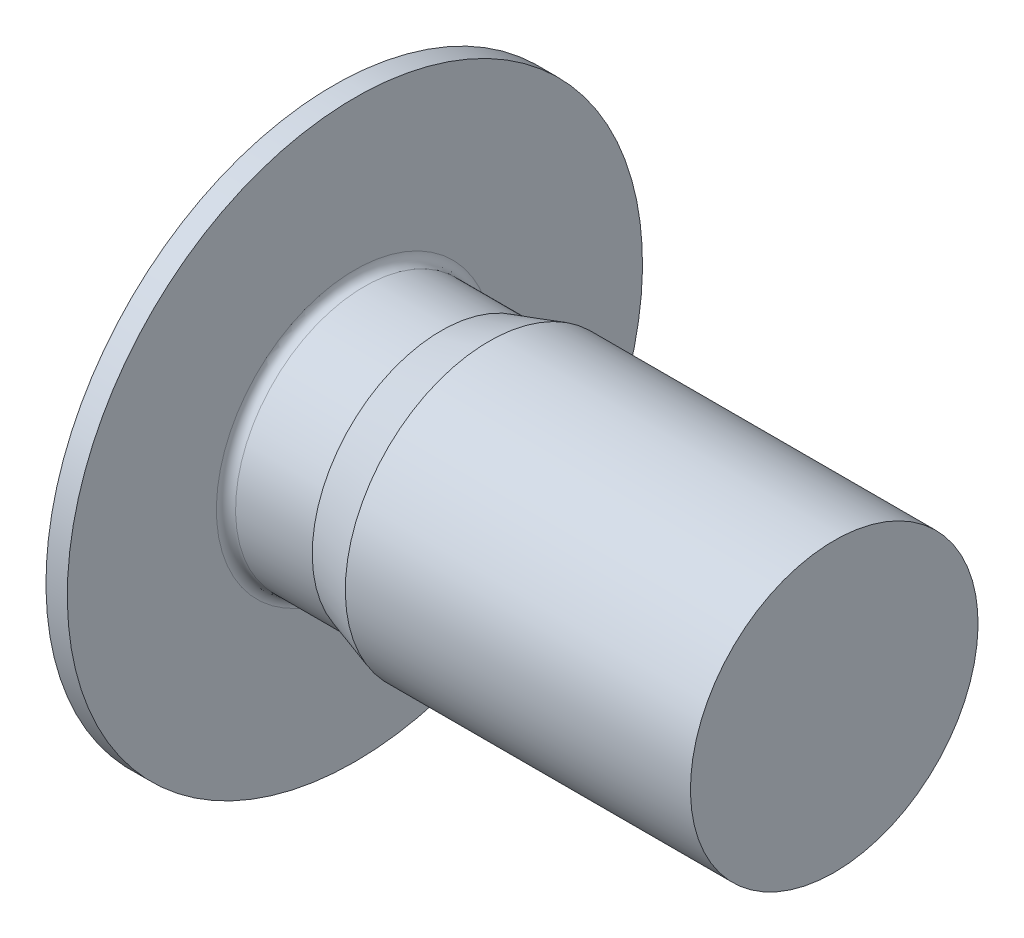
ISO-10303-21;
HEADER;
FILE_DESCRIPTION(('STEP AP214'),'2;1');
FILE_NAME('part.step','',(''),(''),'','','');
FILE_SCHEMA(('AUTOMOTIVE_DESIGN { 1 0 10303 214 1 1 1 1 }'));
ENDSEC;
DATA;
#1=APPLICATION_CONTEXT('core data for automotive mechanical design processes');
#2=APPLICATION_PROTOCOL_DEFINITION('international standard','automotive_design',2000,#1);
#3=PRODUCT_CONTEXT('',#1,'mechanical');
#4=PRODUCT('Part','Part','',(#3));
#5=PRODUCT_RELATED_PRODUCT_CATEGORY('part','',(#4));
#6=PRODUCT_DEFINITION_FORMATION('','',#4);
#7=PRODUCT_DEFINITION_CONTEXT('part definition',#1,'design');
#8=PRODUCT_DEFINITION('design','',#6,#7);
#9=PRODUCT_DEFINITION_SHAPE('','',#8);
#10=(LENGTH_UNIT() NAMED_UNIT(*) SI_UNIT(.MILLI.,.METRE.));
#11=(NAMED_UNIT(*) PLANE_ANGLE_UNIT() SI_UNIT($,.RADIAN.));
#12=(NAMED_UNIT(*) SI_UNIT($,.STERADIAN.) SOLID_ANGLE_UNIT());
#13=UNCERTAINTY_MEASURE_WITH_UNIT(LENGTH_MEASURE(1.E-05),#10,'distance_accuracy_value','');
#14=(GEOMETRIC_REPRESENTATION_CONTEXT(3) GLOBAL_UNCERTAINTY_ASSIGNED_CONTEXT((#13)) GLOBAL_UNIT_ASSIGNED_CONTEXT((#10,
#11,#12)) REPRESENTATION_CONTEXT('',''));
#15=CARTESIAN_POINT('',(0.,0.,0.));
#16=DIRECTION('',(0.,0.,1.));
#17=DIRECTION('',(1.,0.,0.));
#18=AXIS2_PLACEMENT_3D('',#15,#16,#17);
#19=CARTESIAN_POINT('',(1.2,0.,0.));
#20=DIRECTION('',(-1.,0.,0.));
#21=DIRECTION('',(0.,0.,1.));
#22=AXIS2_PLACEMENT_3D('',#19,#20,#21);
#23=PLANE('',#22);
#24=CARTESIAN_POINT('',(1.2,0.,0.));
#25=DIRECTION('',(-1.,0.,0.));
#26=DIRECTION('',(0.,-1.,0.));
#27=AXIS2_PLACEMENT_3D('',#24,#25,#26);
#28=CIRCLE('',#27,0.75);
#29=CARTESIAN_POINT('',(1.2,-0.649519052838329,0.375));
#30=VERTEX_POINT('',#29);
#31=CARTESIAN_POINT('',(1.2,0.,0.75));
#32=VERTEX_POINT('',#31);
#33=EDGE_CURVE('E48',#30,#32,#28,.T.);
#34=ORIENTED_EDGE('',*,*,#33,.F.);
#35=DIRECTION('',(0.,0.5,0.866025403784439));
#36=VECTOR('',#35,1.);
#37=CARTESIAN_POINT('',(1.2,-0.866025403784439,0.));
#38=LINE('',#37,#36);
#39=CARTESIAN_POINT('',(1.2,-0.43301270189222,0.75));
#40=VERTEX_POINT('',#39);
#41=EDGE_CURVE('E263',#30,#40,#38,.T.);
#42=ORIENTED_EDGE('',*,*,#41,.T.);
#43=DIRECTION('',(0.,1.,0.));
#44=VECTOR('',#43,1.);
#45=CARTESIAN_POINT('',(1.2,-0.43301270189222,0.75));
#46=LINE('',#45,#44);
#47=EDGE_CURVE('E231',#40,#32,#46,.T.);
#48=ORIENTED_EDGE('',*,*,#47,.T.);
#49=EDGE_LOOP('',(#34,#42,#48));
#50=FACE_BOUND('',#49,.T.);
#51=ADVANCED_FACE('F37',(#50),#23,.T.);
#52=CARTESIAN_POINT('',(1.2,0.649519052838329,0.375));
#53=VERTEX_POINT('',#52);
#54=EDGE_CURVE('E11',#32,#53,#28,.T.);
#55=ORIENTED_EDGE('',*,*,#54,.F.);
#56=CARTESIAN_POINT('',(1.2,0.43301270189222,0.75));
#57=VERTEX_POINT('',#56);
#58=EDGE_CURVE('E256',#32,#57,#46,.T.);
#59=ORIENTED_EDGE('',*,*,#58,.T.);
#60=DIRECTION('',(0.,0.5,-0.866025403784439));
#61=VECTOR('',#60,1.);
#62=CARTESIAN_POINT('',(1.2,0.43301270189222,0.75));
#63=LINE('',#62,#61);
#64=EDGE_CURVE('E277',#57,#53,#63,.T.);
#65=ORIENTED_EDGE('',*,*,#64,.T.);
#66=EDGE_LOOP('',(#55,#59,#65));
#67=FACE_BOUND('',#66,.T.);
#68=ADVANCED_FACE('F124',(#67),#23,.T.);
#69=CARTESIAN_POINT('',(1.2,0.649519052838329,-0.375));
#70=VERTEX_POINT('',#69);
#71=EDGE_CURVE('E46',#53,#70,#28,.T.);
#72=ORIENTED_EDGE('',*,*,#71,.F.);
#73=CARTESIAN_POINT('',(1.2,0.866025403784439,0.));
#74=VERTEX_POINT('',#73);
#75=EDGE_CURVE('E244',#53,#74,#63,.T.);
#76=ORIENTED_EDGE('',*,*,#75,.T.);
#77=DIRECTION('',(0.,-0.5,-0.866025403784439));
#78=VECTOR('',#77,1.);
#79=CARTESIAN_POINT('',(1.2,0.866025403784439,0.));
#80=LINE('',#79,#78);
#81=EDGE_CURVE('E274',#74,#70,#80,.T.);
#82=ORIENTED_EDGE('',*,*,#81,.T.);
#83=EDGE_LOOP('',(#72,#76,#82));
#84=FACE_BOUND('',#83,.T.);
#85=ADVANCED_FACE('F129',(#84),#23,.T.);
#86=CARTESIAN_POINT('',(1.2,0.,-0.75));
#87=VERTEX_POINT('',#86);
#88=EDGE_CURVE('E222',#70,#87,#28,.T.);
#89=ORIENTED_EDGE('',*,*,#88,.F.);
#90=CARTESIAN_POINT('',(1.2,0.433012701892219,-0.75));
#91=VERTEX_POINT('',#90);
#92=EDGE_CURVE('E276',#70,#91,#80,.T.);
#93=ORIENTED_EDGE('',*,*,#92,.T.);
#94=DIRECTION('',(0.,-1.,0.));
#95=VECTOR('',#94,1.);
#96=CARTESIAN_POINT('',(1.2,0.433012701892219,-0.75));
#97=LINE('',#96,#95);
#98=EDGE_CURVE('E270',#91,#87,#97,.T.);
#99=ORIENTED_EDGE('',*,*,#98,.T.);
#100=EDGE_LOOP('',(#89,#93,#99));
#101=FACE_BOUND('',#100,.T.);
#102=ADVANCED_FACE('F188',(#101),#23,.T.);
#103=CARTESIAN_POINT('',(1.2,-0.649519052838329,-0.375));
#104=VERTEX_POINT('',#103);
#105=EDGE_CURVE('E55',#87,#104,#28,.T.);
#106=ORIENTED_EDGE('',*,*,#105,.F.);
#107=CARTESIAN_POINT('',(1.2,-0.43301270189222,-0.75));
#108=VERTEX_POINT('',#107);
#109=EDGE_CURVE('E273',#87,#108,#97,.T.);
#110=ORIENTED_EDGE('',*,*,#109,.T.);
#111=DIRECTION('',(0.,-0.5,0.866025403784438));
#112=VECTOR('',#111,1.);
#113=CARTESIAN_POINT('',(1.2,-0.43301270189222,-0.75));
#114=LINE('',#113,#112);
#115=EDGE_CURVE('E265',#108,#104,#114,.T.);
#116=ORIENTED_EDGE('',*,*,#115,.T.);
#117=EDGE_LOOP('',(#106,#110,#116));
#118=FACE_BOUND('',#117,.T.);
#119=ADVANCED_FACE('F122',(#118),#23,.T.);
#120=CARTESIAN_POINT('',(-0.8,0.,0.));
#121=DIRECTION('',(-1.,0.,0.));
#122=DIRECTION('',(0.,-1.,0.));
#123=AXIS2_PLACEMENT_3D('',#120,#121,#122);
#124=CYLINDRICAL_SURFACE('',#123,1.345);
#125=CARTESIAN_POINT('',(0.1,0.,0.));
#126=DIRECTION('',(-1.,0.,0.));
#127=DIRECTION('',(0.,-1.,0.));
#128=AXIS2_PLACEMENT_3D('',#125,#126,#127);
#129=CIRCLE('',#128,1.345);
#130=CARTESIAN_POINT('',(0.1,-1.345,0.));
#131=VERTEX_POINT('',#130);
#132=EDGE_CURVE('E41',#131,#131,#129,.F.);
#133=ORIENTED_EDGE('',*,*,#132,.T.);
#134=EDGE_LOOP('',(#133));
#135=FACE_BOUND('',#134,.T.);
#136=CARTESIAN_POINT('',(0.9,0.,0.));
#137=DIRECTION('',(-1.,0.,0.));
#138=DIRECTION('',(0.,-1.,0.));
#139=AXIS2_PLACEMENT_3D('',#136,#137,#138);
#140=CIRCLE('',#139,1.345);
#141=CARTESIAN_POINT('',(0.9,-1.345,0.));
#142=VERTEX_POINT('',#141);
#143=EDGE_CURVE('E195',#142,#142,#140,.T.);
#144=ORIENTED_EDGE('',*,*,#143,.T.);
#145=EDGE_LOOP('',(#144));
#146=FACE_BOUND('',#145,.T.);
#147=ADVANCED_FACE('F181',(#135,#146),#124,.T.);
#148=CARTESIAN_POINT('',(0.,3.,0.));
#149=DIRECTION('',(-1.,0.,0.));
#150=DIRECTION('',(0.,-1.,0.));
#151=AXIS2_PLACEMENT_3D('',#148,#149,#150);
#152=PLANE('',#151);
#153=CARTESIAN_POINT('',(0.,0.,0.));
#154=DIRECTION('',(-1.,0.,0.));
#155=DIRECTION('',(0.,-1.,0.));
#156=AXIS2_PLACEMENT_3D('',#153,#154,#155);
#157=CIRCLE('',#156,1.445);
#158=CARTESIAN_POINT('',(0.,-1.445,0.));
#159=VERTEX_POINT('',#158);
#160=EDGE_CURVE('E218',#159,#159,#157,.T.);
#161=ORIENTED_EDGE('',*,*,#160,.T.);
#162=EDGE_LOOP('',(#161));
#163=FACE_BOUND('',#162,.T.);
#164=CARTESIAN_POINT('',(0.,0.,0.));
#165=DIRECTION('',(-1.,0.,0.));
#166=DIRECTION('',(0.,-1.,0.));
#167=AXIS2_PLACEMENT_3D('',#164,#165,#166);
#168=CIRCLE('',#167,3.);
#169=CARTESIAN_POINT('',(0.,-3.,0.));
#170=VERTEX_POINT('',#169);
#171=EDGE_CURVE('E216',#170,#170,#168,.T.);
#172=ORIENTED_EDGE('',*,*,#171,.F.);
#173=EDGE_LOOP('',(#172));
#174=FACE_BOUND('',#173,.T.);
#175=ADVANCED_FACE('F178',(#163,#174),#152,.F.);
#176=CARTESIAN_POINT('',(-0.8,0.,0.));
#177=DIRECTION('',(-1.,0.,0.));
#178=DIRECTION('',(0.,-1.,0.));
#179=AXIS2_PLACEMENT_3D('',#176,#177,#178);
#180=CYLINDRICAL_SURFACE('',#179,3.);
#181=CARTESIAN_POINT('',(-0.222649730810382,0.,0.));
#182=DIRECTION('',(-1.,0.,0.));
#183=DIRECTION('',(0.,-1.,0.));
#184=AXIS2_PLACEMENT_3D('',#181,#182,#183);
#185=CIRCLE('',#184,3.);
#186=CARTESIAN_POINT('',(-0.222649730810382,-3.,0.));
#187=VERTEX_POINT('',#186);
#188=EDGE_CURVE('E213',#187,#187,#185,.T.);
#189=ORIENTED_EDGE('',*,*,#188,.F.);
#190=EDGE_LOOP('',(#189));
#191=FACE_BOUND('',#190,.T.);
#192=ORIENTED_EDGE('',*,*,#171,.T.);
#193=EDGE_LOOP('',(#192));
#194=FACE_BOUND('',#193,.T.);
#195=ADVANCED_FACE('F174',(#191,#194),#180,.T.);
#196=CARTESIAN_POINT('',(-0.222649730810382,0.,0.));
#197=DIRECTION('',(1.,0.,0.));
#198=DIRECTION('',(0.,1.,0.));
#199=AXIS2_PLACEMENT_3D('',#196,#197,#198);
#200=CONICAL_SURFACE('',#199,3.,1.0471975511966);
#201=CARTESIAN_POINT('',(-0.8,0.,0.));
#202=DIRECTION('',(-1.,0.,0.));
#203=DIRECTION('',(0.,-1.,0.));
#204=AXIS2_PLACEMENT_3D('',#201,#202,#203);
#205=CIRCLE('',#204,2.);
#206=CARTESIAN_POINT('',(-0.799999999999999,-2.,0.));
#207=VERTEX_POINT('',#206);
#208=EDGE_CURVE('E210',#207,#207,#205,.T.);
#209=ORIENTED_EDGE('',*,*,#208,.F.);
#210=EDGE_LOOP('',(#209));
#211=FACE_BOUND('',#210,.T.);
#212=ORIENTED_EDGE('',*,*,#188,.T.);
#213=EDGE_LOOP('',(#212));
#214=FACE_BOUND('',#213,.T.);
#215=ADVANCED_FACE('F170',(#211,#214),#200,.T.);
#216=CARTESIAN_POINT('',(-0.8,0.,0.));
#217=DIRECTION('',(1.,0.,0.));
#218=DIRECTION('',(0.,1.,0.));
#219=AXIS2_PLACEMENT_3D('',#216,#217,#218);
#220=PLANE('',#219);
#221=DIRECTION('',(0.,-0.5,-0.866025403784439));
#222=VECTOR('',#221,1.);
#223=CARTESIAN_POINT('',(-0.8,0.866025403784439,0.));
#224=LINE('',#223,#222);
#225=CARTESIAN_POINT('',(-0.8,0.866025403784439,0.));
#226=VERTEX_POINT('',#225);
#227=CARTESIAN_POINT('',(-0.8,0.433012701892219,-0.75));
#228=VERTEX_POINT('',#227);
#229=EDGE_CURVE('E225',#226,#228,#224,.T.);
#230=ORIENTED_EDGE('',*,*,#229,.F.);
#231=DIRECTION('',(0.,0.5,-0.866025403784439));
#232=VECTOR('',#231,1.);
#233=CARTESIAN_POINT('',(-0.8,0.43301270189222,0.75));
#234=LINE('',#233,#232);
#235=CARTESIAN_POINT('',(-0.8,0.43301270189222,0.75));
#236=VERTEX_POINT('',#235);
#237=EDGE_CURVE('E63',#236,#226,#234,.T.);
#238=ORIENTED_EDGE('',*,*,#237,.F.);
#239=DIRECTION('',(0.,1.,0.));
#240=VECTOR('',#239,1.);
#241=CARTESIAN_POINT('',(-0.8,-0.43301270189222,0.75));
#242=LINE('',#241,#240);
#243=CARTESIAN_POINT('',(-0.8,-0.43301270189222,0.75));
#244=VERTEX_POINT('',#243);
#245=EDGE_CURVE('E242',#244,#236,#242,.T.);
#246=ORIENTED_EDGE('',*,*,#245,.F.);
#247=DIRECTION('',(0.,0.5,0.866025403784439));
#248=VECTOR('',#247,1.);
#249=CARTESIAN_POINT('',(-0.8,-0.866025403784439,0.));
#250=LINE('',#249,#248);
#251=CARTESIAN_POINT('',(-0.8,-0.866025403784439,0.));
#252=VERTEX_POINT('',#251);
#253=EDGE_CURVE('E239',#252,#244,#250,.T.);
#254=ORIENTED_EDGE('',*,*,#253,.F.);
#255=DIRECTION('',(0.,-0.5,0.866025403784438));
#256=VECTOR('',#255,1.);
#257=CARTESIAN_POINT('',(-0.8,-0.43301270189222,-0.75));
#258=LINE('',#257,#256);
#259=CARTESIAN_POINT('',(-0.8,-0.43301270189222,-0.75));
#260=VERTEX_POINT('',#259);
#261=EDGE_CURVE('E236',#260,#252,#258,.T.);
#262=ORIENTED_EDGE('',*,*,#261,.F.);
#263=DIRECTION('',(0.,-1.,0.));
#264=VECTOR('',#263,1.);
#265=CARTESIAN_POINT('',(-0.8,0.433012701892219,-0.75));
#266=LINE('',#265,#264);
#267=EDGE_CURVE('E228',#228,#260,#266,.T.);
#268=ORIENTED_EDGE('',*,*,#267,.F.);
#269=EDGE_LOOP('',(#230,#238,#246,#254,#262,#268));
#270=FACE_BOUND('',#269,.T.);
#271=ORIENTED_EDGE('',*,*,#208,.T.);
#272=EDGE_LOOP('',(#271));
#273=FACE_BOUND('',#272,.T.);
#274=ADVANCED_FACE('F166',(#270,#273),#220,.F.);
#275=CARTESIAN_POINT('',(5.,1.5,0.));
#276=DIRECTION('',(-1.,0.,0.));
#277=DIRECTION('',(0.,-1.,0.));
#278=AXIS2_PLACEMENT_3D('',#275,#276,#277);
#279=PLANE('',#278);
#280=CARTESIAN_POINT('',(5.,0.,0.));
#281=DIRECTION('',(-1.,0.,0.));
#282=DIRECTION('',(0.,-1.,0.));
#283=AXIS2_PLACEMENT_3D('',#280,#281,#282);
#284=CIRCLE('',#283,1.5);
#285=CARTESIAN_POINT('',(5.,-1.5,0.));
#286=VERTEX_POINT('',#285);
#287=EDGE_CURVE('E200',#286,#286,#284,.T.);
#288=ORIENTED_EDGE('',*,*,#287,.F.);
#289=EDGE_LOOP('',(#288));
#290=FACE_BOUND('',#289,.T.);
#291=ADVANCED_FACE('F162',(#290),#279,.F.);
#292=CARTESIAN_POINT('',(-0.8,0.,0.));
#293=DIRECTION('',(-1.,0.,0.));
#294=DIRECTION('',(0.,-1.,0.));
#295=AXIS2_PLACEMENT_3D('',#292,#293,#294);
#296=CYLINDRICAL_SURFACE('',#295,1.5);
#297=CARTESIAN_POINT('',(1.4,0.,0.));
#298=DIRECTION('',(-1.,0.,0.));
#299=DIRECTION('',(0.,-1.,0.));
#300=AXIS2_PLACEMENT_3D('',#297,#298,#299);
#301=CIRCLE('',#300,1.5);
#302=CARTESIAN_POINT('',(1.4,-1.5,0.));
#303=VERTEX_POINT('',#302);
#304=EDGE_CURVE('E196',#303,#303,#301,.T.);
#305=ORIENTED_EDGE('',*,*,#304,.F.);
#306=EDGE_LOOP('',(#305));
#307=FACE_BOUND('',#306,.T.);
#308=ORIENTED_EDGE('',*,*,#287,.T.);
#309=EDGE_LOOP('',(#308));
#310=FACE_BOUND('',#309,.T.);
#311=ADVANCED_FACE('F158',(#307,#310),#296,.T.);
#312=CARTESIAN_POINT('',(1.4,0.,0.));
#313=DIRECTION('',(1.,0.,0.));
#314=DIRECTION('',(0.,1.,0.));
#315=AXIS2_PLACEMENT_3D('',#312,#313,#314);
#316=CONICAL_SURFACE('',#315,1.5,0.300605670042395);
#317=ORIENTED_EDGE('',*,*,#143,.F.);
#318=EDGE_LOOP('',(#317));
#319=FACE_BOUND('',#318,.T.);
#320=ORIENTED_EDGE('',*,*,#304,.T.);
#321=EDGE_LOOP('',(#320));
#322=FACE_BOUND('',#321,.T.);
#323=ADVANCED_FACE('F155',(#319,#322),#316,.T.);
#324=CARTESIAN_POINT('',(0.1,0.,0.));
#325=DIRECTION('',(-1.,0.,0.));
#326=DIRECTION('',(0.,-1.,0.));
#327=AXIS2_PLACEMENT_3D('',#324,#325,#326);
#328=TOROIDAL_SURFACE('',#327,1.445,0.1);
#329=ORIENTED_EDGE('',*,*,#132,.F.);
#330=EDGE_LOOP('',(#329));
#331=FACE_BOUND('',#330,.T.);
#332=ORIENTED_EDGE('',*,*,#160,.F.);
#333=EDGE_LOOP('',(#332));
#334=FACE_BOUND('',#333,.T.);
#335=ADVANCED_FACE('F39',(#331,#334),#328,.F.);
#336=CARTESIAN_POINT('',(1.2,0.43301270189222,0.75));
#337=DIRECTION('',(0.,0.866025403784439,0.5));
#338=DIRECTION('',(0.,-0.5,0.866025403784439));
#339=AXIS2_PLACEMENT_3D('',#336,#337,#338);
#340=PLANE('',#339);
#341=ORIENTED_EDGE('',*,*,#237,.T.);
#342=DIRECTION('',(-1.,0.,0.));
#343=VECTOR('',#342,1.);
#344=CARTESIAN_POINT('',(1.2,0.866025403784439,0.));
#345=LINE('',#344,#343);
#346=EDGE_CURVE('E205',#74,#226,#345,.T.);
#347=ORIENTED_EDGE('',*,*,#346,.F.);
#348=ORIENTED_EDGE('',*,*,#75,.F.);
#349=ORIENTED_EDGE('',*,*,#64,.F.);
#350=DIRECTION('',(-1.,0.,0.));
#351=VECTOR('',#350,1.);
#352=CARTESIAN_POINT('',(1.2,0.43301270189222,0.75));
#353=LINE('',#352,#351);
#354=EDGE_CURVE('E197',#57,#236,#353,.T.);
#355=ORIENTED_EDGE('',*,*,#354,.T.);
#356=EDGE_LOOP('',(#341,#347,#348,#349,#355));
#357=FACE_BOUND('',#356,.T.);
#358=ADVANCED_FACE('F137',(#357),#340,.F.);
#359=CARTESIAN_POINT('',(1.2,-0.43301270189222,0.75));
#360=DIRECTION('',(0.,0.,1.));
#361=DIRECTION('',(0.,-1.,0.));
#362=AXIS2_PLACEMENT_3D('',#359,#360,#361);
#363=PLANE('',#362);
#364=ORIENTED_EDGE('',*,*,#245,.T.);
#365=ORIENTED_EDGE('',*,*,#354,.F.);
#366=ORIENTED_EDGE('',*,*,#58,.F.);
#367=ORIENTED_EDGE('',*,*,#47,.F.);
#368=DIRECTION('',(-1.,0.,0.));
#369=VECTOR('',#368,1.);
#370=CARTESIAN_POINT('',(1.2,-0.43301270189222,0.75));
#371=LINE('',#370,#369);
#372=EDGE_CURVE('E202',#40,#244,#371,.T.);
#373=ORIENTED_EDGE('',*,*,#372,.T.);
#374=EDGE_LOOP('',(#364,#365,#366,#367,#373));
#375=FACE_BOUND('',#374,.T.);
#376=ADVANCED_FACE('F133',(#375),#363,.F.);
#377=CARTESIAN_POINT('',(1.2,-0.866025403784439,0.));
#378=DIRECTION('',(0.,-0.866025403784439,0.5));
#379=DIRECTION('',(0.,-0.5,-0.866025403784439));
#380=AXIS2_PLACEMENT_3D('',#377,#378,#379);
#381=PLANE('',#380);
#382=ORIENTED_EDGE('',*,*,#253,.T.);
#383=ORIENTED_EDGE('',*,*,#372,.F.);
#384=ORIENTED_EDGE('',*,*,#41,.F.);
#385=CARTESIAN_POINT('',(1.2,-0.866025403784439,0.));
#386=VERTEX_POINT('',#385);
#387=EDGE_CURVE('E258',#386,#30,#38,.T.);
#388=ORIENTED_EDGE('',*,*,#387,.F.);
#389=DIRECTION('',(-1.,0.,0.));
#390=VECTOR('',#389,1.);
#391=CARTESIAN_POINT('',(1.2,-0.866025403784439,0.));
#392=LINE('',#391,#390);
#393=EDGE_CURVE('E247',#386,#252,#392,.T.);
#394=ORIENTED_EDGE('',*,*,#393,.T.);
#395=EDGE_LOOP('',(#382,#383,#384,#388,#394));
#396=FACE_BOUND('',#395,.T.);
#397=ADVANCED_FACE('F136',(#396),#381,.F.);
#398=CARTESIAN_POINT('',(1.2,-0.43301270189222,-0.75));
#399=DIRECTION('',(0.,-0.866025403784438,-0.5));
#400=DIRECTION('',(0.,0.5,-0.866025403784439));
#401=AXIS2_PLACEMENT_3D('',#398,#399,#400);
#402=PLANE('',#401);
#403=ORIENTED_EDGE('',*,*,#261,.T.);
#404=ORIENTED_EDGE('',*,*,#393,.F.);
#405=EDGE_CURVE('E269',#104,#386,#114,.T.);
#406=ORIENTED_EDGE('',*,*,#405,.F.);
#407=ORIENTED_EDGE('',*,*,#115,.F.);
#408=DIRECTION('',(-1.,0.,0.));
#409=VECTOR('',#408,1.);
#410=CARTESIAN_POINT('',(1.2,-0.43301270189222,-0.75));
#411=LINE('',#410,#409);
#412=EDGE_CURVE('E249',#108,#260,#411,.T.);
#413=ORIENTED_EDGE('',*,*,#412,.T.);
#414=EDGE_LOOP('',(#403,#404,#406,#407,#413));
#415=FACE_BOUND('',#414,.T.);
#416=ADVANCED_FACE('F141',(#415),#402,.F.);
#417=CARTESIAN_POINT('',(1.2,0.433012701892219,-0.75));
#418=DIRECTION('',(0.,0.,-1.));
#419=DIRECTION('',(-1.,0.,0.));
#420=AXIS2_PLACEMENT_3D('',#417,#418,#419);
#421=PLANE('',#420);
#422=ORIENTED_EDGE('',*,*,#267,.T.);
#423=ORIENTED_EDGE('',*,*,#412,.F.);
#424=ORIENTED_EDGE('',*,*,#109,.F.);
#425=ORIENTED_EDGE('',*,*,#98,.F.);
#426=DIRECTION('',(-1.,0.,0.));
#427=VECTOR('',#426,1.);
#428=CARTESIAN_POINT('',(1.2,0.433012701892219,-0.75));
#429=LINE('',#428,#427);
#430=EDGE_CURVE('E250',#91,#228,#429,.T.);
#431=ORIENTED_EDGE('',*,*,#430,.T.);
#432=EDGE_LOOP('',(#422,#423,#424,#425,#431));
#433=FACE_BOUND('',#432,.T.);
#434=ADVANCED_FACE('F145',(#433),#421,.F.);
#435=CARTESIAN_POINT('',(1.2,0.866025403784439,0.));
#436=DIRECTION('',(0.,0.866025403784439,-0.5));
#437=DIRECTION('',(0.,0.5,0.866025403784439));
#438=AXIS2_PLACEMENT_3D('',#435,#436,#437);
#439=PLANE('',#438);
#440=ORIENTED_EDGE('',*,*,#229,.T.);
#441=ORIENTED_EDGE('',*,*,#430,.F.);
#442=ORIENTED_EDGE('',*,*,#92,.F.);
#443=ORIENTED_EDGE('',*,*,#81,.F.);
#444=ORIENTED_EDGE('',*,*,#346,.T.);
#445=EDGE_LOOP('',(#440,#441,#442,#443,#444));
#446=FACE_BOUND('',#445,.T.);
#447=ADVANCED_FACE('F119',(#446),#439,.F.);
#448=EDGE_CURVE('E221',#104,#30,#28,.T.);
#449=ORIENTED_EDGE('',*,*,#448,.F.);
#450=ORIENTED_EDGE('',*,*,#405,.T.);
#451=ORIENTED_EDGE('',*,*,#387,.T.);
#452=EDGE_LOOP('',(#449,#450,#451));
#453=FACE_BOUND('',#452,.T.);
#454=ADVANCED_FACE('F114',(#453),#23,.T.);
#455=CARTESIAN_POINT('',(1.65064546427067,0.,0.));
#456=DIRECTION('',(-1.,0.,0.));
#457=DIRECTION('',(0.,-1.,0.));
#458=AXIS2_PLACEMENT_3D('',#455,#456,#457);
#459=CONICAL_SURFACE('',#458,0.,1.02974425867666);
#460=ORIENTED_EDGE('',*,*,#33,.T.);
#461=ORIENTED_EDGE('',*,*,#54,.T.);
#462=ORIENTED_EDGE('',*,*,#71,.T.);
#463=ORIENTED_EDGE('',*,*,#88,.T.);
#464=ORIENTED_EDGE('',*,*,#105,.T.);
#465=ORIENTED_EDGE('',*,*,#448,.T.);
#466=EDGE_LOOP('',(#460,#461,#462,#463,#464,#465));
#467=FACE_BOUND('',#466,.T.);
#468=CARTESIAN_POINT('',(1.65064546427067,0.,0.));
#469=VERTEX_POINT('',#468);
#470=VERTEX_LOOP('',#469);
#471=FACE_BOUND('',#470,.T.);
#472=ADVANCED_FACE('F112',(#467,#471),#459,.F.);
#473=CLOSED_SHELL('',(#51,#68,#85,#102,#119,#147,#175,#195,#215,#274,#291,#311,#323,#335,#358,
#376,#397,#416,#434,#447,#454,#472));
#474=MANIFOLD_SOLID_BREP('B2',#473);
#475=ADVANCED_BREP_SHAPE_REPRESENTATION('',(#18,#474),#14);
#476=SHAPE_DEFINITION_REPRESENTATION(#9,#475);
ENDSEC;
END-ISO-10303-21;
